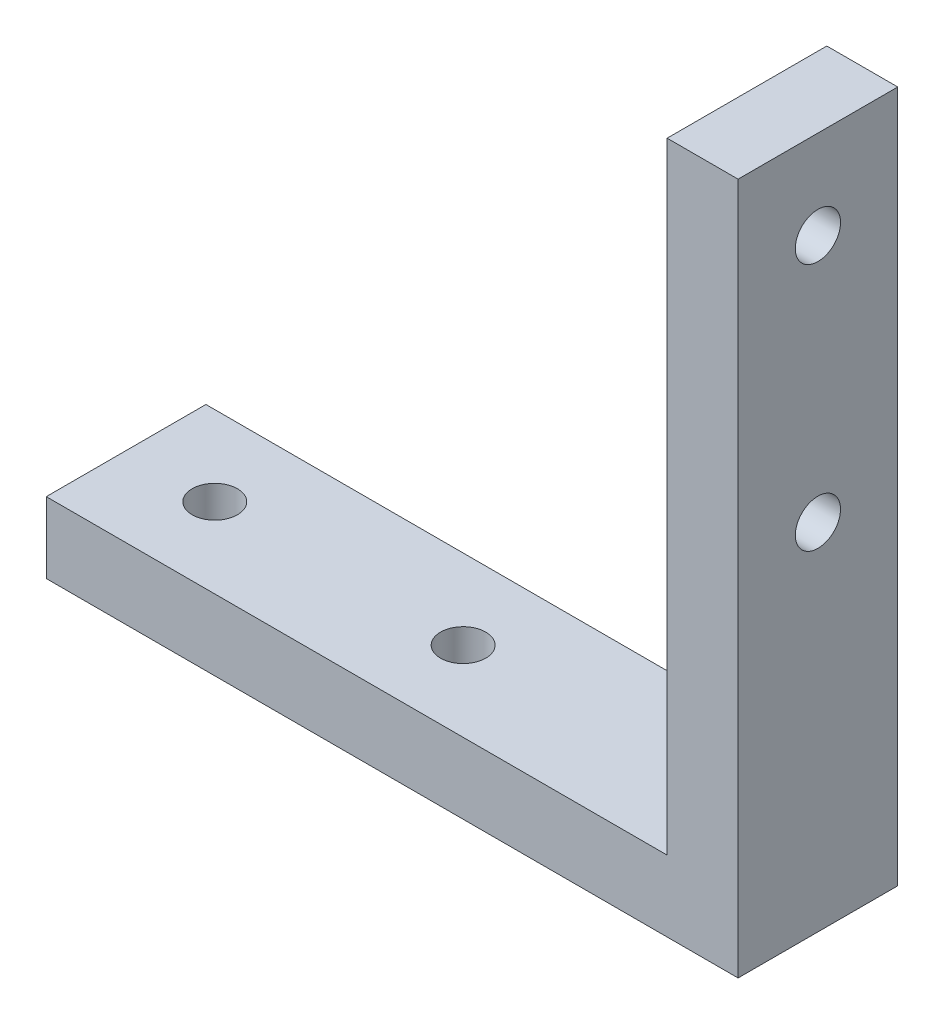
ISO-10303-21;
HEADER;
FILE_DESCRIPTION(('STEP AP214'),'2;1');
FILE_NAME('part.step','',(''),(''),'','','');
FILE_SCHEMA(('AUTOMOTIVE_DESIGN { 1 0 10303 214 1 1 1 1 }'));
ENDSEC;
DATA;
#1=APPLICATION_CONTEXT('core data for automotive mechanical design processes');
#2=APPLICATION_PROTOCOL_DEFINITION('international standard','automotive_design',2000,#1);
#3=PRODUCT_CONTEXT('',#1,'mechanical');
#4=PRODUCT('Part','Part','',(#3));
#5=PRODUCT_RELATED_PRODUCT_CATEGORY('part','',(#4));
#6=PRODUCT_DEFINITION_FORMATION('','',#4);
#7=PRODUCT_DEFINITION_CONTEXT('part definition',#1,'design');
#8=PRODUCT_DEFINITION('design','',#6,#7);
#9=PRODUCT_DEFINITION_SHAPE('','',#8);
#10=(LENGTH_UNIT() NAMED_UNIT(*) SI_UNIT(.MILLI.,.METRE.));
#11=(NAMED_UNIT(*) PLANE_ANGLE_UNIT() SI_UNIT($,.RADIAN.));
#12=(NAMED_UNIT(*) SI_UNIT($,.STERADIAN.) SOLID_ANGLE_UNIT());
#13=UNCERTAINTY_MEASURE_WITH_UNIT(LENGTH_MEASURE(1.E-05),#10,'distance_accuracy_value','');
#14=(GEOMETRIC_REPRESENTATION_CONTEXT(3) GLOBAL_UNCERTAINTY_ASSIGNED_CONTEXT((#13)) GLOBAL_UNIT_ASSIGNED_CONTEXT((#10,
#11,#12)) REPRESENTATION_CONTEXT('',''));
#15=CARTESIAN_POINT('',(0.,0.,0.));
#16=DIRECTION('',(0.,0.,1.));
#17=DIRECTION('',(1.,0.,0.));
#18=AXIS2_PLACEMENT_3D('',#15,#16,#17);
#19=CARTESIAN_POINT('',(-8.,78.,9.));
#20=DIRECTION('',(0.,-1.,0.));
#21=DIRECTION('',(0.,0.,-1.));
#22=AXIS2_PLACEMENT_3D('',#19,#20,#21);
#23=PLANE('',#22);
#24=DIRECTION('',(-1.,0.,0.));
#25=VECTOR('',#24,1.);
#26=CARTESIAN_POINT('',(-8.,78.,-9.));
#27=LINE('',#26,#25);
#28=CARTESIAN_POINT('',(0.,78.,-9.));
#29=VERTEX_POINT('',#28);
#30=CARTESIAN_POINT('',(-8.,78.,-9.));
#31=VERTEX_POINT('',#30);
#32=EDGE_CURVE('E119',#29,#31,#27,.T.);
#33=ORIENTED_EDGE('',*,*,#32,.T.);
#34=DIRECTION('',(0.,0.,-1.));
#35=VECTOR('',#34,1.);
#36=CARTESIAN_POINT('',(-8.,78.,9.));
#37=LINE('',#36,#35);
#38=CARTESIAN_POINT('',(-8.,78.,9.));
#39=VERTEX_POINT('',#38);
#40=EDGE_CURVE('E11',#39,#31,#37,.T.);
#41=ORIENTED_EDGE('',*,*,#40,.F.);
#42=DIRECTION('',(-1.,0.,0.));
#43=VECTOR('',#42,1.);
#44=CARTESIAN_POINT('',(-8.,78.,9.));
#45=LINE('',#44,#43);
#46=CARTESIAN_POINT('',(0.,78.,9.));
#47=VERTEX_POINT('',#46);
#48=EDGE_CURVE('E130',#47,#39,#45,.T.);
#49=ORIENTED_EDGE('',*,*,#48,.F.);
#50=DIRECTION('',(0.,0.,-1.));
#51=VECTOR('',#50,1.);
#52=CARTESIAN_POINT('',(0.,78.,9.));
#53=LINE('',#52,#51);
#54=EDGE_CURVE('E115',#47,#29,#53,.T.);
#55=ORIENTED_EDGE('',*,*,#54,.T.);
#56=EDGE_LOOP('',(#33,#41,#49,#55));
#57=FACE_BOUND('',#56,.T.);
#58=ADVANCED_FACE('F35',(#57),#23,.F.);
#59=CARTESIAN_POINT('',(-8.,7.99999999999999,9.));
#60=DIRECTION('',(1.,0.,0.));
#61=DIRECTION('',(0.,1.,0.));
#62=AXIS2_PLACEMENT_3D('',#59,#60,#61);
#63=PLANE('',#62);
#64=CARTESIAN_POINT('',(-8.,40.,0.));
#65=DIRECTION('',(-1.,0.,0.));
#66=DIRECTION('',(0.,-1.,0.));
#67=AXIS2_PLACEMENT_3D('',#64,#65,#66);
#68=CIRCLE('',#67,2.55);
#69=CARTESIAN_POINT('',(-8.,37.45,0.));
#70=VERTEX_POINT('',#69);
#71=EDGE_CURVE('E252',#70,#70,#68,.T.);
#72=ORIENTED_EDGE('',*,*,#71,.F.);
#73=EDGE_LOOP('',(#72));
#74=FACE_BOUND('',#73,.T.);
#75=CARTESIAN_POINT('',(-8.,68.,0.));
#76=DIRECTION('',(-1.,0.,0.));
#77=DIRECTION('',(0.,-1.,0.));
#78=AXIS2_PLACEMENT_3D('',#75,#76,#77);
#79=CIRCLE('',#78,2.55);
#80=CARTESIAN_POINT('',(-8.,65.45,0.));
#81=VERTEX_POINT('',#80);
#82=EDGE_CURVE('E258',#81,#81,#79,.T.);
#83=ORIENTED_EDGE('',*,*,#82,.F.);
#84=EDGE_LOOP('',(#83));
#85=FACE_BOUND('',#84,.T.);
#86=DIRECTION('',(0.,-1.,0.));
#87=VECTOR('',#86,1.);
#88=CARTESIAN_POINT('',(-8.,7.99999999999999,-9.));
#89=LINE('',#88,#87);
#90=CARTESIAN_POINT('',(-8.,7.99999999999999,-9.));
#91=VERTEX_POINT('',#90);
#92=EDGE_CURVE('E122',#31,#91,#89,.T.);
#93=ORIENTED_EDGE('',*,*,#92,.T.);
#94=DIRECTION('',(0.,0.,-1.));
#95=VECTOR('',#94,1.);
#96=CARTESIAN_POINT('',(-8.,7.99999999999999,9.));
#97=LINE('',#96,#95);
#98=CARTESIAN_POINT('',(-8.,7.99999999999999,9.));
#99=VERTEX_POINT('',#98);
#100=EDGE_CURVE('E43',#99,#91,#97,.T.);
#101=ORIENTED_EDGE('',*,*,#100,.F.);
#102=DIRECTION('',(0.,-1.,0.));
#103=VECTOR('',#102,1.);
#104=CARTESIAN_POINT('',(-8.,7.99999999999999,9.));
#105=LINE('',#104,#103);
#106=EDGE_CURVE('E88',#39,#99,#105,.T.);
#107=ORIENTED_EDGE('',*,*,#106,.F.);
#108=ORIENTED_EDGE('',*,*,#40,.T.);
#109=EDGE_LOOP('',(#93,#101,#107,#108));
#110=FACE_BOUND('',#109,.T.);
#111=ADVANCED_FACE('F158',(#74,#85,#110),#63,.F.);
#112=CARTESIAN_POINT('',(-78.,7.99999999999999,9.));
#113=DIRECTION('',(0.,-1.,0.));
#114=DIRECTION('',(1.,0.,0.));
#115=AXIS2_PLACEMENT_3D('',#112,#113,#114);
#116=PLANE('',#115);
#117=CARTESIAN_POINT('',(-68.,7.99999999999999,0.));
#118=DIRECTION('',(0.,1.,0.));
#119=DIRECTION('',(-1.,0.,0.));
#120=AXIS2_PLACEMENT_3D('',#117,#118,#119);
#121=CIRCLE('',#120,2.54999999999999);
#122=CARTESIAN_POINT('',(-70.55,7.99999999999999,0.));
#123=VERTEX_POINT('',#122);
#124=EDGE_CURVE('E265',#123,#123,#121,.T.);
#125=ORIENTED_EDGE('',*,*,#124,.F.);
#126=EDGE_LOOP('',(#125));
#127=FACE_BOUND('',#126,.T.);
#128=CARTESIAN_POINT('',(-40.,7.99999999999999,0.));
#129=DIRECTION('',(0.,1.,0.));
#130=DIRECTION('',(-1.,0.,0.));
#131=AXIS2_PLACEMENT_3D('',#128,#129,#130);
#132=CIRCLE('',#131,2.55);
#133=CARTESIAN_POINT('',(-42.55,7.99999999999999,0.));
#134=VERTEX_POINT('',#133);
#135=EDGE_CURVE('E255',#134,#134,#132,.T.);
#136=ORIENTED_EDGE('',*,*,#135,.F.);
#137=EDGE_LOOP('',(#136));
#138=FACE_BOUND('',#137,.T.);
#139=DIRECTION('',(-1.,0.,0.));
#140=VECTOR('',#139,1.);
#141=CARTESIAN_POINT('',(-78.,7.99999999999999,-9.));
#142=LINE('',#141,#140);
#143=CARTESIAN_POINT('',(-78.,7.99999999999999,-9.));
#144=VERTEX_POINT('',#143);
#145=EDGE_CURVE('E125',#91,#144,#142,.T.);
#146=ORIENTED_EDGE('',*,*,#145,.T.);
#147=DIRECTION('',(0.,0.,-1.));
#148=VECTOR('',#147,1.);
#149=CARTESIAN_POINT('',(-78.,7.99999999999999,9.));
#150=LINE('',#149,#148);
#151=CARTESIAN_POINT('',(-78.,7.99999999999999,9.));
#152=VERTEX_POINT('',#151);
#153=EDGE_CURVE('E110',#152,#144,#150,.T.);
#154=ORIENTED_EDGE('',*,*,#153,.F.);
#155=DIRECTION('',(-1.,0.,0.));
#156=VECTOR('',#155,1.);
#157=CARTESIAN_POINT('',(-78.,7.99999999999999,9.));
#158=LINE('',#157,#156);
#159=EDGE_CURVE('E101',#99,#152,#158,.T.);
#160=ORIENTED_EDGE('',*,*,#159,.F.);
#161=ORIENTED_EDGE('',*,*,#100,.T.);
#162=EDGE_LOOP('',(#146,#154,#160,#161));
#163=FACE_BOUND('',#162,.T.);
#164=ADVANCED_FACE('F136',(#127,#138,#163),#116,.F.);
#165=CARTESIAN_POINT('',(-78.,0.,9.));
#166=DIRECTION('',(1.,0.,0.));
#167=DIRECTION('',(0.,0.,-1.));
#168=AXIS2_PLACEMENT_3D('',#165,#166,#167);
#169=PLANE('',#168);
#170=DIRECTION('',(0.,-1.,0.));
#171=VECTOR('',#170,1.);
#172=CARTESIAN_POINT('',(-78.,0.,-9.));
#173=LINE('',#172,#171);
#174=CARTESIAN_POINT('',(-78.,0.,-9.));
#175=VERTEX_POINT('',#174);
#176=EDGE_CURVE('E109',#144,#175,#173,.T.);
#177=ORIENTED_EDGE('',*,*,#176,.T.);
#178=DIRECTION('',(0.,0.,-1.));
#179=VECTOR('',#178,1.);
#180=CARTESIAN_POINT('',(-78.,0.,9.));
#181=LINE('',#180,#179);
#182=CARTESIAN_POINT('',(-78.,0.,9.));
#183=VERTEX_POINT('',#182);
#184=EDGE_CURVE('E106',#183,#175,#181,.T.);
#185=ORIENTED_EDGE('',*,*,#184,.F.);
#186=DIRECTION('',(0.,-1.,0.));
#187=VECTOR('',#186,1.);
#188=CARTESIAN_POINT('',(-78.,0.,9.));
#189=LINE('',#188,#187);
#190=EDGE_CURVE('E95',#152,#183,#189,.T.);
#191=ORIENTED_EDGE('',*,*,#190,.F.);
#192=ORIENTED_EDGE('',*,*,#153,.T.);
#193=EDGE_LOOP('',(#177,#185,#191,#192));
#194=FACE_BOUND('',#193,.T.);
#195=ADVANCED_FACE('F107',(#194),#169,.F.);
#196=CARTESIAN_POINT('',(0.,0.,9.));
#197=DIRECTION('',(0.,1.,0.));
#198=DIRECTION('',(-1.,0.,0.));
#199=AXIS2_PLACEMENT_3D('',#196,#197,#198);
#200=PLANE('',#199);
#201=CARTESIAN_POINT('',(-68.,0.,0.));
#202=DIRECTION('',(0.,1.,0.));
#203=DIRECTION('',(-1.,0.,0.));
#204=AXIS2_PLACEMENT_3D('',#201,#202,#203);
#205=CIRCLE('',#204,2.54999999999999);
#206=CARTESIAN_POINT('',(-70.55,0.,0.));
#207=VERTEX_POINT('',#206);
#208=EDGE_CURVE('E123',#207,#207,#205,.T.);
#209=ORIENTED_EDGE('',*,*,#208,.T.);
#210=EDGE_LOOP('',(#209));
#211=FACE_BOUND('',#210,.T.);
#212=CARTESIAN_POINT('',(-40.,0.,0.));
#213=DIRECTION('',(0.,1.,0.));
#214=DIRECTION('',(-1.,0.,0.));
#215=AXIS2_PLACEMENT_3D('',#212,#213,#214);
#216=CIRCLE('',#215,2.55);
#217=CARTESIAN_POINT('',(-42.55,0.,0.));
#218=VERTEX_POINT('',#217);
#219=EDGE_CURVE('E268',#218,#218,#216,.T.);
#220=ORIENTED_EDGE('',*,*,#219,.T.);
#221=EDGE_LOOP('',(#220));
#222=FACE_BOUND('',#221,.T.);
#223=DIRECTION('',(1.,0.,0.));
#224=VECTOR('',#223,1.);
#225=CARTESIAN_POINT('',(0.,0.,-9.));
#226=LINE('',#225,#224);
#227=CARTESIAN_POINT('',(0.,0.,-9.));
#228=VERTEX_POINT('',#227);
#229=EDGE_CURVE('E74',#175,#228,#226,.T.);
#230=ORIENTED_EDGE('',*,*,#229,.T.);
#231=DIRECTION('',(0.,0.,-1.));
#232=VECTOR('',#231,1.);
#233=CARTESIAN_POINT('',(0.,0.,9.));
#234=LINE('',#233,#232);
#235=CARTESIAN_POINT('',(0.,0.,9.));
#236=VERTEX_POINT('',#235);
#237=EDGE_CURVE('E111',#236,#228,#234,.T.);
#238=ORIENTED_EDGE('',*,*,#237,.F.);
#239=DIRECTION('',(1.,0.,0.));
#240=VECTOR('',#239,1.);
#241=CARTESIAN_POINT('',(0.,0.,9.));
#242=LINE('',#241,#240);
#243=EDGE_CURVE('E99',#183,#236,#242,.T.);
#244=ORIENTED_EDGE('',*,*,#243,.F.);
#245=ORIENTED_EDGE('',*,*,#184,.T.);
#246=EDGE_LOOP('',(#230,#238,#244,#245));
#247=FACE_BOUND('',#246,.T.);
#248=ADVANCED_FACE('F113',(#211,#222,#247),#200,.F.);
#249=CARTESIAN_POINT('',(0.,78.,9.));
#250=DIRECTION('',(-1.,0.,0.));
#251=DIRECTION('',(0.,-1.,0.));
#252=AXIS2_PLACEMENT_3D('',#249,#250,#251);
#253=PLANE('',#252);
#254=CARTESIAN_POINT('',(0.,40.,0.));
#255=DIRECTION('',(-1.,0.,0.));
#256=DIRECTION('',(0.,-1.,0.));
#257=AXIS2_PLACEMENT_3D('',#254,#255,#256);
#258=CIRCLE('',#257,2.55);
#259=CARTESIAN_POINT('',(0.,37.45,0.));
#260=VERTEX_POINT('',#259);
#261=EDGE_CURVE('E250',#260,#260,#258,.T.);
#262=ORIENTED_EDGE('',*,*,#261,.T.);
#263=EDGE_LOOP('',(#262));
#264=FACE_BOUND('',#263,.T.);
#265=CARTESIAN_POINT('',(0.,68.,0.));
#266=DIRECTION('',(-1.,0.,0.));
#267=DIRECTION('',(0.,-1.,0.));
#268=AXIS2_PLACEMENT_3D('',#265,#266,#267);
#269=CIRCLE('',#268,2.55);
#270=CARTESIAN_POINT('',(0.,65.45,0.));
#271=VERTEX_POINT('',#270);
#272=EDGE_CURVE('E253',#271,#271,#269,.T.);
#273=ORIENTED_EDGE('',*,*,#272,.T.);
#274=EDGE_LOOP('',(#273));
#275=FACE_BOUND('',#274,.T.);
#276=DIRECTION('',(0.,1.,0.));
#277=VECTOR('',#276,1.);
#278=CARTESIAN_POINT('',(0.,78.,-9.));
#279=LINE('',#278,#277);
#280=EDGE_CURVE('E80',#228,#29,#279,.T.);
#281=ORIENTED_EDGE('',*,*,#280,.T.);
#282=ORIENTED_EDGE('',*,*,#54,.F.);
#283=DIRECTION('',(0.,1.,0.));
#284=VECTOR('',#283,1.);
#285=CARTESIAN_POINT('',(0.,78.,9.));
#286=LINE('',#285,#284);
#287=EDGE_CURVE('E51',#236,#47,#286,.T.);
#288=ORIENTED_EDGE('',*,*,#287,.F.);
#289=ORIENTED_EDGE('',*,*,#237,.T.);
#290=EDGE_LOOP('',(#281,#282,#288,#289));
#291=FACE_BOUND('',#290,.T.);
#292=ADVANCED_FACE('F143',(#264,#275,#291),#253,.F.);
#293=CARTESIAN_POINT('',(0.,0.,9.));
#294=DIRECTION('',(0.,0.,-1.));
#295=DIRECTION('',(-1.,0.,0.));
#296=AXIS2_PLACEMENT_3D('',#293,#294,#295);
#297=PLANE('',#296);
#298=ORIENTED_EDGE('',*,*,#48,.T.);
#299=ORIENTED_EDGE('',*,*,#106,.T.);
#300=ORIENTED_EDGE('',*,*,#159,.T.);
#301=ORIENTED_EDGE('',*,*,#190,.T.);
#302=ORIENTED_EDGE('',*,*,#243,.T.);
#303=ORIENTED_EDGE('',*,*,#287,.T.);
#304=EDGE_LOOP('',(#298,#299,#300,#301,#302,#303));
#305=FACE_BOUND('',#304,.T.);
#306=ADVANCED_FACE('F97',(#305),#297,.F.);
#307=CARTESIAN_POINT('',(0.,0.,-9.));
#308=DIRECTION('',(0.,0.,-1.));
#309=DIRECTION('',(-1.,0.,0.));
#310=AXIS2_PLACEMENT_3D('',#307,#308,#309);
#311=PLANE('',#310);
#312=ORIENTED_EDGE('',*,*,#32,.F.);
#313=ORIENTED_EDGE('',*,*,#280,.F.);
#314=ORIENTED_EDGE('',*,*,#229,.F.);
#315=ORIENTED_EDGE('',*,*,#176,.F.);
#316=ORIENTED_EDGE('',*,*,#145,.F.);
#317=ORIENTED_EDGE('',*,*,#92,.F.);
#318=EDGE_LOOP('',(#312,#313,#314,#315,#316,#317));
#319=FACE_BOUND('',#318,.T.);
#320=ADVANCED_FACE('F139',(#319),#311,.T.);
#321=CARTESIAN_POINT('',(-40.,0.,0.));
#322=DIRECTION('',(0.,1.,0.));
#323=DIRECTION('',(-1.,0.,0.));
#324=AXIS2_PLACEMENT_3D('',#321,#322,#323);
#325=CYLINDRICAL_SURFACE('',#324,2.55);
#326=ORIENTED_EDGE('',*,*,#219,.F.);
#327=EDGE_LOOP('',(#326));
#328=FACE_BOUND('',#327,.T.);
#329=ORIENTED_EDGE('',*,*,#135,.T.);
#330=EDGE_LOOP('',(#329));
#331=FACE_BOUND('',#330,.T.);
#332=ADVANCED_FACE('F190',(#328,#331),#325,.F.);
#333=CARTESIAN_POINT('',(-68.,0.,0.));
#334=DIRECTION('',(0.,1.,0.));
#335=DIRECTION('',(-1.,0.,0.));
#336=AXIS2_PLACEMENT_3D('',#333,#334,#335);
#337=CYLINDRICAL_SURFACE('',#336,2.54999999999999);
#338=ORIENTED_EDGE('',*,*,#208,.F.);
#339=EDGE_LOOP('',(#338));
#340=FACE_BOUND('',#339,.T.);
#341=ORIENTED_EDGE('',*,*,#124,.T.);
#342=EDGE_LOOP('',(#341));
#343=FACE_BOUND('',#342,.T.);
#344=ADVANCED_FACE('F195',(#340,#343),#337,.F.);
#345=CARTESIAN_POINT('',(0.,68.,0.));
#346=DIRECTION('',(-1.,0.,0.));
#347=DIRECTION('',(0.,-1.,0.));
#348=AXIS2_PLACEMENT_3D('',#345,#346,#347);
#349=CYLINDRICAL_SURFACE('',#348,2.55);
#350=ORIENTED_EDGE('',*,*,#272,.F.);
#351=EDGE_LOOP('',(#350));
#352=FACE_BOUND('',#351,.T.);
#353=ORIENTED_EDGE('',*,*,#82,.T.);
#354=EDGE_LOOP('',(#353));
#355=FACE_BOUND('',#354,.T.);
#356=ADVANCED_FACE('F206',(#352,#355),#349,.F.);
#357=CARTESIAN_POINT('',(0.,40.,0.));
#358=DIRECTION('',(-1.,0.,0.));
#359=DIRECTION('',(0.,-1.,0.));
#360=AXIS2_PLACEMENT_3D('',#357,#358,#359);
#361=CYLINDRICAL_SURFACE('',#360,2.55);
#362=ORIENTED_EDGE('',*,*,#261,.F.);
#363=EDGE_LOOP('',(#362));
#364=FACE_BOUND('',#363,.T.);
#365=ORIENTED_EDGE('',*,*,#71,.T.);
#366=EDGE_LOOP('',(#365));
#367=FACE_BOUND('',#366,.T.);
#368=ADVANCED_FACE('F226',(#364,#367),#361,.F.);
#369=CLOSED_SHELL('',(#58,#111,#164,#195,#248,#292,#306,#320,#332,#344,#356,#368));
#370=MANIFOLD_SOLID_BREP('B2',#369);
#371=ADVANCED_BREP_SHAPE_REPRESENTATION('',(#18,#370),#14);
#372=SHAPE_DEFINITION_REPRESENTATION(#9,#371);
ENDSEC;
END-ISO-10303-21;
